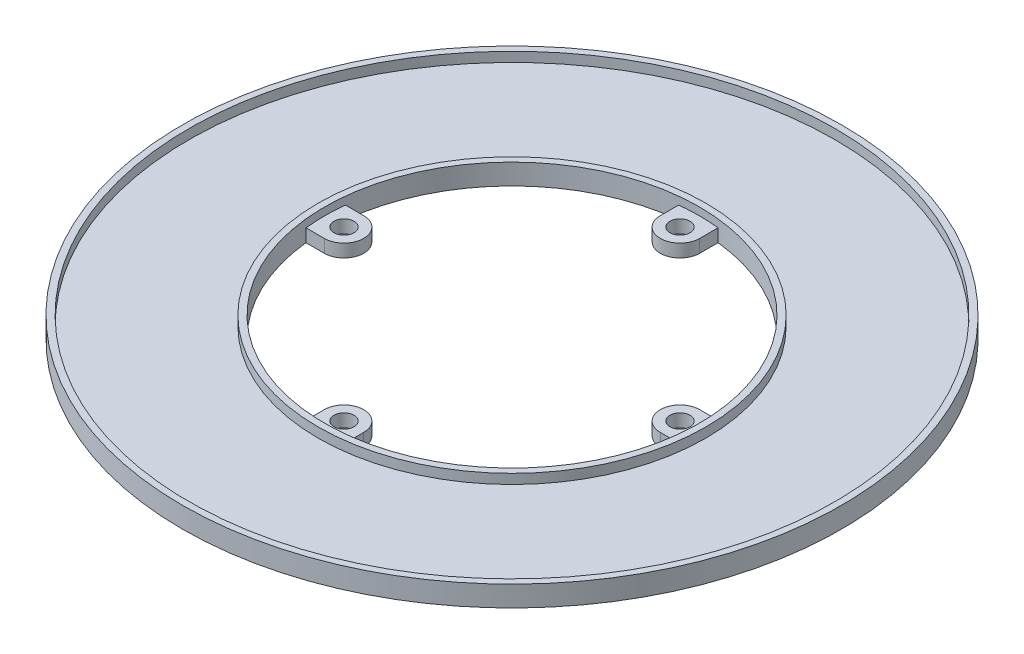
ISO-10303-21;
HEADER;
FILE_DESCRIPTION(('STEP AP214'),'2;1');
FILE_NAME('part.step','',(''),(''),'','','');
FILE_SCHEMA(('AUTOMOTIVE_DESIGN { 1 0 10303 214 1 1 1 1 }'));
ENDSEC;
DATA;
#1=APPLICATION_CONTEXT('core data for automotive mechanical design processes');
#2=APPLICATION_PROTOCOL_DEFINITION('international standard','automotive_design',2000,#1);
#3=PRODUCT_CONTEXT('',#1,'mechanical');
#4=PRODUCT('Part','Part','',(#3));
#5=PRODUCT_RELATED_PRODUCT_CATEGORY('part','',(#4));
#6=PRODUCT_DEFINITION_FORMATION('','',#4);
#7=PRODUCT_DEFINITION_CONTEXT('part definition',#1,'design');
#8=PRODUCT_DEFINITION('design','',#6,#7);
#9=PRODUCT_DEFINITION_SHAPE('','',#8);
#10=(LENGTH_UNIT() NAMED_UNIT(*) SI_UNIT(.MILLI.,.METRE.));
#11=(NAMED_UNIT(*) PLANE_ANGLE_UNIT() SI_UNIT($,.RADIAN.));
#12=(NAMED_UNIT(*) SI_UNIT($,.STERADIAN.) SOLID_ANGLE_UNIT());
#13=UNCERTAINTY_MEASURE_WITH_UNIT(LENGTH_MEASURE(1.E-05),#10,'distance_accuracy_value','');
#14=(GEOMETRIC_REPRESENTATION_CONTEXT(3) GLOBAL_UNCERTAINTY_ASSIGNED_CONTEXT((#13)) GLOBAL_UNIT_ASSIGNED_CONTEXT((#10,
#11,#12)) REPRESENTATION_CONTEXT('',''));
#15=CARTESIAN_POINT('',(0.,0.,0.));
#16=DIRECTION('',(0.,0.,1.));
#17=DIRECTION('',(1.,0.,0.));
#18=AXIS2_PLACEMENT_3D('',#15,#16,#17);
#19=CARTESIAN_POINT('',(0.,0.,0.));
#20=DIRECTION('',(0.,-1.,0.));
#21=DIRECTION('',(0.,0.,-1.));
#22=AXIS2_PLACEMENT_3D('',#19,#20,#21);
#23=CYLINDRICAL_SURFACE('',#22,29.);
#24=CARTESIAN_POINT('',(0.,3.2,0.));
#25=DIRECTION('',(0.,-1.,0.));
#26=DIRECTION('',(0.,0.,-1.));
#27=AXIS2_PLACEMENT_3D('',#24,#25,#26);
#28=CIRCLE('',#27,29.);
#29=CARTESIAN_POINT('',(0.,3.2,-29.));
#30=VERTEX_POINT('',#29);
#31=EDGE_CURVE('E289',#30,#30,#28,.T.);
#32=ORIENTED_EDGE('',*,*,#31,.F.);
#33=EDGE_LOOP('',(#32));
#34=FACE_BOUND('',#33,.T.);
#35=CARTESIAN_POINT('',(0.,2.,0.));
#36=DIRECTION('',(0.,-1.,0.));
#37=DIRECTION('',(0.,0.,-1.));
#38=AXIS2_PLACEMENT_3D('',#35,#36,#37);
#39=CIRCLE('',#38,29.);
#40=CARTESIAN_POINT('',(-28.8391660767089,2.,3.04999999999999));
#41=VERTEX_POINT('',#40);
#42=CARTESIAN_POINT('',(-28.8391660767089,2.,-3.05000000000001));
#43=VERTEX_POINT('',#42);
#44=EDGE_CURVE('E55',#41,#43,#39,.T.);
#45=ORIENTED_EDGE('',*,*,#44,.T.);
#46=DIRECTION('',(0.,-1.,0.));
#47=VECTOR('',#46,1.);
#48=CARTESIAN_POINT('',(-28.8391660767089,2.,-3.04999999999999));
#49=LINE('',#48,#47);
#50=CARTESIAN_POINT('',(-28.8391660767089,0.,-3.04999999999999));
#51=VERTEX_POINT('',#50);
#52=EDGE_CURVE('E295',#43,#51,#49,.T.);
#53=ORIENTED_EDGE('',*,*,#52,.T.);
#54=CARTESIAN_POINT('',(0.,0.,0.));
#55=DIRECTION('',(0.,-1.,0.));
#56=DIRECTION('',(0.,0.,-1.));
#57=AXIS2_PLACEMENT_3D('',#54,#55,#56);
#58=CIRCLE('',#57,29.);
#59=CARTESIAN_POINT('',(-3.05,0.,-28.8391660767089));
#60=VERTEX_POINT('',#59);
#61=EDGE_CURVE('E47',#51,#60,#58,.T.);
#62=ORIENTED_EDGE('',*,*,#61,.T.);
#63=DIRECTION('',(0.,-1.,0.));
#64=VECTOR('',#63,1.);
#65=CARTESIAN_POINT('',(-3.05,2.,-28.8391660767089));
#66=LINE('',#65,#64);
#67=CARTESIAN_POINT('',(-3.05,2.,-28.8391660767089));
#68=VERTEX_POINT('',#67);
#69=EDGE_CURVE('E186',#68,#60,#66,.T.);
#70=ORIENTED_EDGE('',*,*,#69,.F.);
#71=CARTESIAN_POINT('',(0.,2.,0.));
#72=DIRECTION('',(0.,-1.,0.));
#73=DIRECTION('',(0.,0.,-1.));
#74=AXIS2_PLACEMENT_3D('',#71,#72,#73);
#75=CIRCLE('',#74,29.);
#76=CARTESIAN_POINT('',(3.05,2.,-28.8391660767089));
#77=VERTEX_POINT('',#76);
#78=EDGE_CURVE('E209',#68,#77,#75,.T.);
#79=ORIENTED_EDGE('',*,*,#78,.T.);
#80=DIRECTION('',(0.,-1.,0.));
#81=VECTOR('',#80,1.);
#82=CARTESIAN_POINT('',(3.04999999999999,2.,-28.8391660767089));
#83=LINE('',#82,#81);
#84=CARTESIAN_POINT('',(3.04999999999999,0.,-28.8391660767089));
#85=VERTEX_POINT('',#84);
#86=EDGE_CURVE('E169',#77,#85,#83,.T.);
#87=ORIENTED_EDGE('',*,*,#86,.T.);
#88=CARTESIAN_POINT('',(28.8391660767089,0.,-3.05));
#89=VERTEX_POINT('',#88);
#90=EDGE_CURVE('E293',#85,#89,#58,.T.);
#91=ORIENTED_EDGE('',*,*,#90,.T.);
#92=DIRECTION('',(0.,-1.,0.));
#93=VECTOR('',#92,1.);
#94=CARTESIAN_POINT('',(28.8391660767089,2.,-3.05));
#95=LINE('',#94,#93);
#96=CARTESIAN_POINT('',(28.8391660767089,2.,-3.05));
#97=VERTEX_POINT('',#96);
#98=EDGE_CURVE('E215',#97,#89,#95,.T.);
#99=ORIENTED_EDGE('',*,*,#98,.F.);
#100=CARTESIAN_POINT('',(0.,2.,0.));
#101=DIRECTION('',(0.,-1.,0.));
#102=DIRECTION('',(0.,0.,-1.));
#103=AXIS2_PLACEMENT_3D('',#100,#101,#102);
#104=CIRCLE('',#103,29.);
#105=CARTESIAN_POINT('',(28.8391660767089,2.,3.05));
#106=VERTEX_POINT('',#105);
#107=EDGE_CURVE('E239',#97,#106,#104,.T.);
#108=ORIENTED_EDGE('',*,*,#107,.T.);
#109=DIRECTION('',(0.,-1.,0.));
#110=VECTOR('',#109,1.);
#111=CARTESIAN_POINT('',(28.8391660767089,2.,3.05));
#112=LINE('',#111,#110);
#113=CARTESIAN_POINT('',(28.8391660767089,0.,3.05));
#114=VERTEX_POINT('',#113);
#115=EDGE_CURVE('E203',#106,#114,#112,.T.);
#116=ORIENTED_EDGE('',*,*,#115,.T.);
#117=CARTESIAN_POINT('',(3.05,0.,28.8391660767089));
#118=VERTEX_POINT('',#117);
#119=EDGE_CURVE('E48',#114,#118,#58,.T.);
#120=ORIENTED_EDGE('',*,*,#119,.T.);
#121=DIRECTION('',(0.,-1.,0.));
#122=VECTOR('',#121,1.);
#123=CARTESIAN_POINT('',(3.05,2.,28.8391660767089));
#124=LINE('',#123,#122);
#125=CARTESIAN_POINT('',(3.05,2.,28.8391660767089));
#126=VERTEX_POINT('',#125);
#127=EDGE_CURVE('E266',#126,#118,#124,.T.);
#128=ORIENTED_EDGE('',*,*,#127,.F.);
#129=CARTESIAN_POINT('',(0.,2.,0.));
#130=DIRECTION('',(0.,-1.,0.));
#131=DIRECTION('',(0.,0.,-1.));
#132=AXIS2_PLACEMENT_3D('',#129,#130,#131);
#133=CIRCLE('',#132,29.);
#134=CARTESIAN_POINT('',(-3.05,2.,28.8391660767089));
#135=VERTEX_POINT('',#134);
#136=EDGE_CURVE('E246',#126,#135,#133,.T.);
#137=ORIENTED_EDGE('',*,*,#136,.T.);
#138=DIRECTION('',(0.,-1.,0.));
#139=VECTOR('',#138,1.);
#140=CARTESIAN_POINT('',(-3.04999999999999,2.,28.8391660767089));
#141=LINE('',#140,#139);
#142=CARTESIAN_POINT('',(-3.04999999999999,0.,28.8391660767089));
#143=VERTEX_POINT('',#142);
#144=EDGE_CURVE('E269',#135,#143,#141,.T.);
#145=ORIENTED_EDGE('',*,*,#144,.T.);
#146=CARTESIAN_POINT('',(-28.8391660767089,0.,3.04999999999999));
#147=VERTEX_POINT('',#146);
#148=EDGE_CURVE('E11',#143,#147,#58,.T.);
#149=ORIENTED_EDGE('',*,*,#148,.T.);
#150=DIRECTION('',(0.,-1.,0.));
#151=VECTOR('',#150,1.);
#152=CARTESIAN_POINT('',(-28.8391660767089,2.,3.04999999999999));
#153=LINE('',#152,#151);
#154=EDGE_CURVE('E59',#41,#147,#153,.T.);
#155=ORIENTED_EDGE('',*,*,#154,.F.);
#156=EDGE_LOOP('',(#45,#53,#62,#70,#79,#87,#91,#99,#108,#116,#120,#128,#137,#145,#149,#155));
#157=FACE_BOUND('',#156,.T.);
#158=ADVANCED_FACE('F39',(#34,#157),#23,.F.);
#159=CARTESIAN_POINT('',(51.,0.,0.));
#160=DIRECTION('',(0.,-1.,0.));
#161=DIRECTION('',(0.,0.,-1.));
#162=AXIS2_PLACEMENT_3D('',#159,#160,#161);
#163=PLANE('',#162);
#164=CARTESIAN_POINT('',(26.,0.,0.));
#165=DIRECTION('',(0.,-1.,0.));
#166=DIRECTION('',(0.,0.,-1.));
#167=AXIS2_PLACEMENT_3D('',#164,#165,#166);
#168=CIRCLE('',#167,1.55);
#169=CARTESIAN_POINT('',(26.,0.,-1.55000000000009));
#170=VERTEX_POINT('',#169);
#171=EDGE_CURVE('E652',#170,#170,#168,.T.);
#172=ORIENTED_EDGE('',*,*,#171,.F.);
#173=EDGE_LOOP('',(#172));
#174=FACE_BOUND('',#173,.T.);
#175=CARTESIAN_POINT('',(0.,0.,26.));
#176=DIRECTION('',(0.,-1.,0.));
#177=DIRECTION('',(0.,0.,-1.));
#178=AXIS2_PLACEMENT_3D('',#175,#176,#177);
#179=CIRCLE('',#178,1.55);
#180=CARTESIAN_POINT('',(0.,0.,24.45));
#181=VERTEX_POINT('',#180);
#182=EDGE_CURVE('E646',#181,#181,#179,.T.);
#183=ORIENTED_EDGE('',*,*,#182,.F.);
#184=EDGE_LOOP('',(#183));
#185=FACE_BOUND('',#184,.T.);
#186=CARTESIAN_POINT('',(-1.81557029619843E-13,0.,-26.));
#187=DIRECTION('',(0.,-1.,0.));
#188=DIRECTION('',(0.,0.,-1.));
#189=AXIS2_PLACEMENT_3D('',#186,#187,#188);
#190=CIRCLE('',#189,1.55);
#191=CARTESIAN_POINT('',(-1.81557029619843E-13,0.,-27.55));
#192=VERTEX_POINT('',#191);
#193=EDGE_CURVE('E650',#192,#192,#190,.T.);
#194=ORIENTED_EDGE('',*,*,#193,.F.);
#195=EDGE_LOOP('',(#194));
#196=FACE_BOUND('',#195,.T.);
#197=CARTESIAN_POINT('',(-26.,0.,2.72335544429764E-13));
#198=DIRECTION('',(0.,-1.,0.));
#199=DIRECTION('',(0.,0.,-1.));
#200=AXIS2_PLACEMENT_3D('',#197,#198,#199);
#201=CIRCLE('',#200,1.55);
#202=CARTESIAN_POINT('',(-26.,0.,-1.54999999999973));
#203=VERTEX_POINT('',#202);
#204=EDGE_CURVE('E662',#203,#203,#201,.T.);
#205=ORIENTED_EDGE('',*,*,#204,.F.);
#206=EDGE_LOOP('',(#205));
#207=FACE_BOUND('',#206,.T.);
#208=CARTESIAN_POINT('',(0.,0.,0.));
#209=DIRECTION('',(0.,-1.,0.));
#210=DIRECTION('',(0.,0.,-1.));
#211=AXIS2_PLACEMENT_3D('',#208,#209,#210);
#212=CIRCLE('',#211,51.);
#213=CARTESIAN_POINT('',(0.,0.,-51.));
#214=VERTEX_POINT('',#213);
#215=EDGE_CURVE('E272',#214,#214,#212,.T.);
#216=ORIENTED_EDGE('',*,*,#215,.T.);
#217=EDGE_LOOP('',(#216));
#218=FACE_BOUND('',#217,.T.);
#219=ORIENTED_EDGE('',*,*,#148,.F.);
#220=DIRECTION('',(0.,0.,1.));
#221=VECTOR('',#220,1.);
#222=CARTESIAN_POINT('',(-3.05,0.,26.));
#223=LINE('',#222,#221);
#224=CARTESIAN_POINT('',(-3.05,0.,26.));
#225=VERTEX_POINT('',#224);
#226=EDGE_CURVE('E233',#225,#143,#223,.T.);
#227=ORIENTED_EDGE('',*,*,#226,.F.);
#228=CARTESIAN_POINT('',(0.,0.,26.));
#229=DIRECTION('',(0.,-1.,0.));
#230=DIRECTION('',(0.,0.,-1.));
#231=AXIS2_PLACEMENT_3D('',#228,#229,#230);
#232=CIRCLE('',#231,3.05);
#233=CARTESIAN_POINT('',(3.05,0.,26.));
#234=VERTEX_POINT('',#233);
#235=EDGE_CURVE('E247',#225,#234,#232,.T.);
#236=ORIENTED_EDGE('',*,*,#235,.T.);
#237=DIRECTION('',(0.,0.,1.));
#238=VECTOR('',#237,1.);
#239=CARTESIAN_POINT('',(3.05,0.,26.));
#240=LINE('',#239,#238);
#241=EDGE_CURVE('E258',#234,#118,#240,.T.);
#242=ORIENTED_EDGE('',*,*,#241,.T.);
#243=ORIENTED_EDGE('',*,*,#119,.F.);
#244=DIRECTION('',(1.,0.,0.));
#245=VECTOR('',#244,1.);
#246=CARTESIAN_POINT('',(26.,0.,3.05));
#247=LINE('',#246,#245);
#248=CARTESIAN_POINT('',(26.,0.,3.04999999999991));
#249=VERTEX_POINT('',#248);
#250=EDGE_CURVE('E230',#249,#114,#247,.T.);
#251=ORIENTED_EDGE('',*,*,#250,.F.);
#252=CARTESIAN_POINT('',(26.,0.,0.));
#253=DIRECTION('',(0.,-1.,0.));
#254=DIRECTION('',(0.,0.,-1.));
#255=AXIS2_PLACEMENT_3D('',#252,#253,#254);
#256=CIRCLE('',#255,3.05);
#257=CARTESIAN_POINT('',(26.,0.,-3.05000000000009));
#258=VERTEX_POINT('',#257);
#259=EDGE_CURVE('E223',#249,#258,#256,.T.);
#260=ORIENTED_EDGE('',*,*,#259,.T.);
#261=DIRECTION('',(1.,0.,0.));
#262=VECTOR('',#261,1.);
#263=CARTESIAN_POINT('',(26.,0.,-3.05));
#264=LINE('',#263,#262);
#265=EDGE_CURVE('E226',#258,#89,#264,.T.);
#266=ORIENTED_EDGE('',*,*,#265,.T.);
#267=ORIENTED_EDGE('',*,*,#90,.F.);
#268=DIRECTION('',(0.,0.,-1.));
#269=VECTOR('',#268,1.);
#270=CARTESIAN_POINT('',(3.05,0.,-26.));
#271=LINE('',#270,#269);
#272=CARTESIAN_POINT('',(3.04999999999982,0.,-26.));
#273=VERTEX_POINT('',#272);
#274=EDGE_CURVE('E200',#273,#85,#271,.T.);
#275=ORIENTED_EDGE('',*,*,#274,.F.);
#276=CARTESIAN_POINT('',(-1.81557029619843E-13,0.,-26.));
#277=DIRECTION('',(0.,-1.,0.));
#278=DIRECTION('',(0.,0.,-1.));
#279=AXIS2_PLACEMENT_3D('',#276,#277,#278);
#280=CIRCLE('',#279,3.05);
#281=CARTESIAN_POINT('',(-3.05000000000018,0.,-26.));
#282=VERTEX_POINT('',#281);
#283=EDGE_CURVE('E194',#273,#282,#280,.T.);
#284=ORIENTED_EDGE('',*,*,#283,.T.);
#285=DIRECTION('',(0.,0.,-1.));
#286=VECTOR('',#285,1.);
#287=CARTESIAN_POINT('',(-3.05,0.,-26.));
#288=LINE('',#287,#286);
#289=EDGE_CURVE('E197',#282,#60,#288,.T.);
#290=ORIENTED_EDGE('',*,*,#289,.T.);
#291=ORIENTED_EDGE('',*,*,#61,.F.);
#292=DIRECTION('',(-1.,0.,0.));
#293=VECTOR('',#292,1.);
#294=CARTESIAN_POINT('',(-26.,0.,-3.05));
#295=LINE('',#294,#293);
#296=CARTESIAN_POINT('',(-26.,0.,-3.04999999999973));
#297=VERTEX_POINT('',#296);
#298=EDGE_CURVE('E155',#297,#51,#295,.T.);
#299=ORIENTED_EDGE('',*,*,#298,.F.);
#300=CARTESIAN_POINT('',(-26.,0.,2.72335544429764E-13));
#301=DIRECTION('',(0.,-1.,0.));
#302=DIRECTION('',(0.,0.,-1.));
#303=AXIS2_PLACEMENT_3D('',#300,#301,#302);
#304=CIRCLE('',#303,3.05);
#305=CARTESIAN_POINT('',(-26.,0.,3.05000000000027));
#306=VERTEX_POINT('',#305);
#307=EDGE_CURVE('E167',#297,#306,#304,.T.);
#308=ORIENTED_EDGE('',*,*,#307,.T.);
#309=DIRECTION('',(-1.,0.,0.));
#310=VECTOR('',#309,1.);
#311=CARTESIAN_POINT('',(-26.,0.,3.04999999999999));
#312=LINE('',#311,#310);
#313=EDGE_CURVE('E170',#306,#147,#312,.T.);
#314=ORIENTED_EDGE('',*,*,#313,.T.);
#315=EDGE_LOOP('',(#219,#227,#236,#242,#243,#251,#260,#266,#267,#275,#284,#290,#291,#299,#308,#314));
#316=FACE_BOUND('',#315,.T.);
#317=ADVANCED_FACE('F41',(#174,#185,#196,#207,#218,#316),#163,.T.);
#318=CARTESIAN_POINT('',(29.,3.2,0.));
#319=DIRECTION('',(0.,1.,0.));
#320=DIRECTION('',(0.,0.,1.));
#321=AXIS2_PLACEMENT_3D('',#318,#319,#320);
#322=PLANE('',#321);
#323=ORIENTED_EDGE('',*,*,#31,.T.);
#324=EDGE_LOOP('',(#323));
#325=FACE_BOUND('',#324,.T.);
#326=CARTESIAN_POINT('',(0.,3.2,0.));
#327=DIRECTION('',(0.,-1.,0.));
#328=DIRECTION('',(0.,0.,-1.));
#329=AXIS2_PLACEMENT_3D('',#326,#327,#328);
#330=CIRCLE('',#329,30.);
#331=CARTESIAN_POINT('',(0.,3.2,-30.));
#332=VERTEX_POINT('',#331);
#333=EDGE_CURVE('E287',#332,#332,#330,.T.);
#334=ORIENTED_EDGE('',*,*,#333,.F.);
#335=EDGE_LOOP('',(#334));
#336=FACE_BOUND('',#335,.T.);
#337=ADVANCED_FACE('F328',(#325,#336),#322,.T.);
#338=CARTESIAN_POINT('',(0.,0.,0.));
#339=DIRECTION('',(0.,-1.,0.));
#340=DIRECTION('',(0.,0.,-1.));
#341=AXIS2_PLACEMENT_3D('',#338,#339,#340);
#342=CYLINDRICAL_SURFACE('',#341,30.);
#343=ORIENTED_EDGE('',*,*,#333,.T.);
#344=EDGE_LOOP('',(#343));
#345=FACE_BOUND('',#344,.T.);
#346=CARTESIAN_POINT('',(0.,1.7,0.));
#347=DIRECTION('',(0.,-1.,0.));
#348=DIRECTION('',(0.,0.,-1.));
#349=AXIS2_PLACEMENT_3D('',#346,#347,#348);
#350=CIRCLE('',#349,30.);
#351=CARTESIAN_POINT('',(0.,1.7,-30.));
#352=VERTEX_POINT('',#351);
#353=EDGE_CURVE('E284',#352,#352,#350,.T.);
#354=ORIENTED_EDGE('',*,*,#353,.F.);
#355=EDGE_LOOP('',(#354));
#356=FACE_BOUND('',#355,.T.);
#357=ADVANCED_FACE('F333',(#345,#356),#342,.T.);
#358=CARTESIAN_POINT('',(30.,1.7,0.));
#359=DIRECTION('',(0.,1.,0.));
#360=DIRECTION('',(0.,0.,1.));
#361=AXIS2_PLACEMENT_3D('',#358,#359,#360);
#362=PLANE('',#361);
#363=ORIENTED_EDGE('',*,*,#353,.T.);
#364=EDGE_LOOP('',(#363));
#365=FACE_BOUND('',#364,.T.);
#366=CARTESIAN_POINT('',(0.,1.7,0.));
#367=DIRECTION('',(0.,-1.,0.));
#368=DIRECTION('',(0.,0.,-1.));
#369=AXIS2_PLACEMENT_3D('',#366,#367,#368);
#370=CIRCLE('',#369,50.);
#371=CARTESIAN_POINT('',(0.,1.7,-50.));
#372=VERTEX_POINT('',#371);
#373=EDGE_CURVE('E281',#372,#372,#370,.T.);
#374=ORIENTED_EDGE('',*,*,#373,.F.);
#375=EDGE_LOOP('',(#374));
#376=FACE_BOUND('',#375,.T.);
#377=ADVANCED_FACE('F336',(#365,#376),#362,.T.);
#378=CARTESIAN_POINT('',(0.,0.,0.));
#379=DIRECTION('',(0.,-1.,0.));
#380=DIRECTION('',(0.,0.,-1.));
#381=AXIS2_PLACEMENT_3D('',#378,#379,#380);
#382=CYLINDRICAL_SURFACE('',#381,50.);
#383=ORIENTED_EDGE('',*,*,#373,.T.);
#384=EDGE_LOOP('',(#383));
#385=FACE_BOUND('',#384,.T.);
#386=CARTESIAN_POINT('',(0.,3.2,0.));
#387=DIRECTION('',(0.,-1.,0.));
#388=DIRECTION('',(0.,0.,-1.));
#389=AXIS2_PLACEMENT_3D('',#386,#387,#388);
#390=CIRCLE('',#389,50.);
#391=CARTESIAN_POINT('',(0.,3.2,-50.));
#392=VERTEX_POINT('',#391);
#393=EDGE_CURVE('E278',#392,#392,#390,.T.);
#394=ORIENTED_EDGE('',*,*,#393,.F.);
#395=EDGE_LOOP('',(#394));
#396=FACE_BOUND('',#395,.T.);
#397=ADVANCED_FACE('F340',(#385,#396),#382,.F.);
#398=CARTESIAN_POINT('',(50.,3.2,0.));
#399=DIRECTION('',(0.,1.,0.));
#400=DIRECTION('',(0.,0.,1.));
#401=AXIS2_PLACEMENT_3D('',#398,#399,#400);
#402=PLANE('',#401);
#403=ORIENTED_EDGE('',*,*,#393,.T.);
#404=EDGE_LOOP('',(#403));
#405=FACE_BOUND('',#404,.T.);
#406=CARTESIAN_POINT('',(0.,3.2,0.));
#407=DIRECTION('',(0.,-1.,0.));
#408=DIRECTION('',(0.,0.,-1.));
#409=AXIS2_PLACEMENT_3D('',#406,#407,#408);
#410=CIRCLE('',#409,51.);
#411=CARTESIAN_POINT('',(0.,3.2,-51.));
#412=VERTEX_POINT('',#411);
#413=EDGE_CURVE('E275',#412,#412,#410,.T.);
#414=ORIENTED_EDGE('',*,*,#413,.F.);
#415=EDGE_LOOP('',(#414));
#416=FACE_BOUND('',#415,.T.);
#417=ADVANCED_FACE('F344',(#405,#416),#402,.T.);
#418=CARTESIAN_POINT('',(0.,0.,0.));
#419=DIRECTION('',(0.,-1.,0.));
#420=DIRECTION('',(0.,0.,-1.));
#421=AXIS2_PLACEMENT_3D('',#418,#419,#420);
#422=CYLINDRICAL_SURFACE('',#421,51.);
#423=ORIENTED_EDGE('',*,*,#413,.T.);
#424=EDGE_LOOP('',(#423));
#425=FACE_BOUND('',#424,.T.);
#426=ORIENTED_EDGE('',*,*,#215,.F.);
#427=EDGE_LOOP('',(#426));
#428=FACE_BOUND('',#427,.T.);
#429=ADVANCED_FACE('F348',(#425,#428),#422,.T.);
#430=CARTESIAN_POINT('',(-3.05,2.,26.));
#431=DIRECTION('',(1.,0.,0.));
#432=DIRECTION('',(0.,0.,-1.));
#433=AXIS2_PLACEMENT_3D('',#430,#431,#432);
#434=PLANE('',#433);
#435=ORIENTED_EDGE('',*,*,#226,.T.);
#436=ORIENTED_EDGE('',*,*,#144,.F.);
#437=DIRECTION('',(0.,0.,1.));
#438=VECTOR('',#437,1.);
#439=CARTESIAN_POINT('',(-3.05,2.,26.));
#440=LINE('',#439,#438);
#441=CARTESIAN_POINT('',(-3.05,2.,26.));
#442=VERTEX_POINT('',#441);
#443=EDGE_CURVE('E243',#442,#135,#440,.T.);
#444=ORIENTED_EDGE('',*,*,#443,.F.);
#445=DIRECTION('',(0.,-1.,0.));
#446=VECTOR('',#445,1.);
#447=CARTESIAN_POINT('',(-3.05,2.,26.));
#448=LINE('',#447,#446);
#449=EDGE_CURVE('E255',#442,#225,#448,.T.);
#450=ORIENTED_EDGE('',*,*,#449,.T.);
#451=EDGE_LOOP('',(#435,#436,#444,#450));
#452=FACE_BOUND('',#451,.T.);
#453=ADVANCED_FACE('F352',(#452),#434,.F.);
#454=CARTESIAN_POINT('',(3.05,2.,26.));
#455=DIRECTION('',(1.,0.,0.));
#456=DIRECTION('',(0.,0.,-1.));
#457=AXIS2_PLACEMENT_3D('',#454,#455,#456);
#458=PLANE('',#457);
#459=ORIENTED_EDGE('',*,*,#241,.F.);
#460=DIRECTION('',(0.,-1.,0.));
#461=VECTOR('',#460,1.);
#462=CARTESIAN_POINT('',(3.05,2.,26.));
#463=LINE('',#462,#461);
#464=CARTESIAN_POINT('',(3.05,2.,26.));
#465=VERTEX_POINT('',#464);
#466=EDGE_CURVE('E264',#465,#234,#463,.T.);
#467=ORIENTED_EDGE('',*,*,#466,.F.);
#468=DIRECTION('',(0.,0.,1.));
#469=VECTOR('',#468,1.);
#470=CARTESIAN_POINT('',(3.05,2.,26.));
#471=LINE('',#470,#469);
#472=EDGE_CURVE('E249',#465,#126,#471,.T.);
#473=ORIENTED_EDGE('',*,*,#472,.T.);
#474=ORIENTED_EDGE('',*,*,#127,.T.);
#475=EDGE_LOOP('',(#459,#467,#473,#474));
#476=FACE_BOUND('',#475,.T.);
#477=ADVANCED_FACE('F356',(#476),#458,.T.);
#478=CARTESIAN_POINT('',(0.,2.,26.));
#479=DIRECTION('',(0.,-1.,0.));
#480=DIRECTION('',(0.,0.,-1.));
#481=AXIS2_PLACEMENT_3D('',#478,#479,#480);
#482=CYLINDRICAL_SURFACE('',#481,3.05);
#483=ORIENTED_EDGE('',*,*,#235,.F.);
#484=ORIENTED_EDGE('',*,*,#449,.F.);
#485=CARTESIAN_POINT('',(0.,2.,26.));
#486=DIRECTION('',(0.,-1.,0.));
#487=DIRECTION('',(0.,0.,-1.));
#488=AXIS2_PLACEMENT_3D('',#485,#486,#487);
#489=CIRCLE('',#488,3.05);
#490=EDGE_CURVE('E252',#442,#465,#489,.T.);
#491=ORIENTED_EDGE('',*,*,#490,.T.);
#492=ORIENTED_EDGE('',*,*,#466,.T.);
#493=EDGE_LOOP('',(#483,#484,#491,#492));
#494=FACE_BOUND('',#493,.T.);
#495=ADVANCED_FACE('F360',(#494),#482,.T.);
#496=CARTESIAN_POINT('',(0.,2.,0.));
#497=DIRECTION('',(0.,-1.,0.));
#498=DIRECTION('',(0.,0.,-1.));
#499=AXIS2_PLACEMENT_3D('',#496,#497,#498);
#500=PLANE('',#499);
#501=CARTESIAN_POINT('',(0.,2.,26.));
#502=DIRECTION('',(0.,-1.,0.));
#503=DIRECTION('',(0.,0.,-1.));
#504=AXIS2_PLACEMENT_3D('',#501,#502,#503);
#505=CIRCLE('',#504,1.55);
#506=CARTESIAN_POINT('',(0.,2.,24.45));
#507=VERTEX_POINT('',#506);
#508=EDGE_CURVE('E649',#507,#507,#505,.F.);
#509=ORIENTED_EDGE('',*,*,#508,.F.);
#510=EDGE_LOOP('',(#509));
#511=FACE_BOUND('',#510,.T.);
#512=ORIENTED_EDGE('',*,*,#443,.T.);
#513=ORIENTED_EDGE('',*,*,#136,.F.);
#514=ORIENTED_EDGE('',*,*,#472,.F.);
#515=ORIENTED_EDGE('',*,*,#490,.F.);
#516=EDGE_LOOP('',(#512,#513,#514,#515));
#517=FACE_BOUND('',#516,.T.);
#518=ADVANCED_FACE('F364',(#511,#517),#500,.F.);
#519=CARTESIAN_POINT('',(26.,2.,3.05));
#520=DIRECTION('',(0.,0.,-1.));
#521=DIRECTION('',(-1.,0.,0.));
#522=AXIS2_PLACEMENT_3D('',#519,#520,#521);
#523=PLANE('',#522);
#524=ORIENTED_EDGE('',*,*,#250,.T.);
#525=ORIENTED_EDGE('',*,*,#115,.F.);
#526=DIRECTION('',(1.,0.,0.));
#527=VECTOR('',#526,1.);
#528=CARTESIAN_POINT('',(26.,2.,3.05));
#529=LINE('',#528,#527);
#530=CARTESIAN_POINT('',(26.,2.,3.04999999999991));
#531=VERTEX_POINT('',#530);
#532=EDGE_CURVE('E227',#531,#106,#529,.T.);
#533=ORIENTED_EDGE('',*,*,#532,.F.);
#534=DIRECTION('',(0.,-1.,0.));
#535=VECTOR('',#534,1.);
#536=CARTESIAN_POINT('',(26.,2.,3.04999999999991));
#537=LINE('',#536,#535);
#538=EDGE_CURVE('E220',#531,#249,#537,.T.);
#539=ORIENTED_EDGE('',*,*,#538,.T.);
#540=EDGE_LOOP('',(#524,#525,#533,#539));
#541=FACE_BOUND('',#540,.T.);
#542=ADVANCED_FACE('F367',(#541),#523,.F.);
#543=CARTESIAN_POINT('',(26.,2.,-3.05));
#544=DIRECTION('',(0.,0.,-1.));
#545=DIRECTION('',(-1.,0.,0.));
#546=AXIS2_PLACEMENT_3D('',#543,#544,#545);
#547=PLANE('',#546);
#548=ORIENTED_EDGE('',*,*,#265,.F.);
#549=DIRECTION('',(0.,-1.,0.));
#550=VECTOR('',#549,1.);
#551=CARTESIAN_POINT('',(26.,2.,-3.05000000000009));
#552=LINE('',#551,#550);
#553=CARTESIAN_POINT('',(26.,2.,-3.05000000000009));
#554=VERTEX_POINT('',#553);
#555=EDGE_CURVE('E218',#554,#258,#552,.T.);
#556=ORIENTED_EDGE('',*,*,#555,.F.);
#557=DIRECTION('',(1.,0.,0.));
#558=VECTOR('',#557,1.);
#559=CARTESIAN_POINT('',(26.,2.,-3.05));
#560=LINE('',#559,#558);
#561=EDGE_CURVE('E236',#554,#97,#560,.T.);
#562=ORIENTED_EDGE('',*,*,#561,.T.);
#563=ORIENTED_EDGE('',*,*,#98,.T.);
#564=EDGE_LOOP('',(#548,#556,#562,#563));
#565=FACE_BOUND('',#564,.T.);
#566=ADVANCED_FACE('F372',(#565),#547,.T.);
#567=CARTESIAN_POINT('',(26.,2.,0.));
#568=DIRECTION('',(0.,-1.,0.));
#569=DIRECTION('',(0.,0.,-1.));
#570=AXIS2_PLACEMENT_3D('',#567,#568,#569);
#571=CYLINDRICAL_SURFACE('',#570,3.05);
#572=ORIENTED_EDGE('',*,*,#259,.F.);
#573=ORIENTED_EDGE('',*,*,#538,.F.);
#574=CARTESIAN_POINT('',(26.,2.,0.));
#575=DIRECTION('',(0.,-1.,0.));
#576=DIRECTION('',(0.,0.,-1.));
#577=AXIS2_PLACEMENT_3D('',#574,#575,#576);
#578=CIRCLE('',#577,3.05);
#579=EDGE_CURVE('E222',#531,#554,#578,.T.);
#580=ORIENTED_EDGE('',*,*,#579,.T.);
#581=ORIENTED_EDGE('',*,*,#555,.T.);
#582=EDGE_LOOP('',(#572,#573,#580,#581));
#583=FACE_BOUND('',#582,.T.);
#584=ADVANCED_FACE('F319',(#583),#571,.T.);
#585=CARTESIAN_POINT('',(0.,2.,0.));
#586=DIRECTION('',(0.,-1.,0.));
#587=DIRECTION('',(0.,0.,-1.));
#588=AXIS2_PLACEMENT_3D('',#585,#586,#587);
#589=PLANE('',#588);
#590=CARTESIAN_POINT('',(26.,2.,0.));
#591=DIRECTION('',(0.,-1.,0.));
#592=DIRECTION('',(0.,0.,-1.));
#593=AXIS2_PLACEMENT_3D('',#590,#591,#592);
#594=CIRCLE('',#593,1.55);
#595=CARTESIAN_POINT('',(26.,2.,-1.55000000000009));
#596=VERTEX_POINT('',#595);
#597=EDGE_CURVE('E658',#596,#596,#594,.F.);
#598=ORIENTED_EDGE('',*,*,#597,.F.);
#599=EDGE_LOOP('',(#598));
#600=FACE_BOUND('',#599,.T.);
#601=ORIENTED_EDGE('',*,*,#532,.T.);
#602=ORIENTED_EDGE('',*,*,#107,.F.);
#603=ORIENTED_EDGE('',*,*,#561,.F.);
#604=ORIENTED_EDGE('',*,*,#579,.F.);
#605=EDGE_LOOP('',(#601,#602,#603,#604));
#606=FACE_BOUND('',#605,.T.);
#607=ADVANCED_FACE('F312',(#600,#606),#589,.F.);
#608=CARTESIAN_POINT('',(3.05,2.,-26.));
#609=DIRECTION('',(-1.,0.,0.));
#610=DIRECTION('',(0.,0.,1.));
#611=AXIS2_PLACEMENT_3D('',#608,#609,#610);
#612=PLANE('',#611);
#613=ORIENTED_EDGE('',*,*,#274,.T.);
#614=ORIENTED_EDGE('',*,*,#86,.F.);
#615=DIRECTION('',(0.,0.,-1.));
#616=VECTOR('',#615,1.);
#617=CARTESIAN_POINT('',(3.05,2.,-26.));
#618=LINE('',#617,#616);
#619=CARTESIAN_POINT('',(3.04999999999982,2.,-26.));
#620=VERTEX_POINT('',#619);
#621=EDGE_CURVE('E198',#620,#77,#618,.T.);
#622=ORIENTED_EDGE('',*,*,#621,.F.);
#623=DIRECTION('',(0.,-1.,0.));
#624=VECTOR('',#623,1.);
#625=CARTESIAN_POINT('',(3.04999999999982,2.,-26.));
#626=LINE('',#625,#624);
#627=EDGE_CURVE('E191',#620,#273,#626,.T.);
#628=ORIENTED_EDGE('',*,*,#627,.T.);
#629=EDGE_LOOP('',(#613,#614,#622,#628));
#630=FACE_BOUND('',#629,.T.);
#631=ADVANCED_FACE('F310',(#630),#612,.F.);
#632=CARTESIAN_POINT('',(-3.05,2.,-26.));
#633=DIRECTION('',(-1.,0.,0.));
#634=DIRECTION('',(0.,0.,1.));
#635=AXIS2_PLACEMENT_3D('',#632,#633,#634);
#636=PLANE('',#635);
#637=ORIENTED_EDGE('',*,*,#289,.F.);
#638=DIRECTION('',(0.,-1.,0.));
#639=VECTOR('',#638,1.);
#640=CARTESIAN_POINT('',(-3.05000000000018,2.,-26.));
#641=LINE('',#640,#639);
#642=CARTESIAN_POINT('',(-3.05000000000018,2.,-26.));
#643=VERTEX_POINT('',#642);
#644=EDGE_CURVE('E189',#643,#282,#641,.T.);
#645=ORIENTED_EDGE('',*,*,#644,.F.);
#646=DIRECTION('',(0.,0.,-1.));
#647=VECTOR('',#646,1.);
#648=CARTESIAN_POINT('',(-3.05,2.,-26.));
#649=LINE('',#648,#647);
#650=EDGE_CURVE('E206',#643,#68,#649,.T.);
#651=ORIENTED_EDGE('',*,*,#650,.T.);
#652=ORIENTED_EDGE('',*,*,#69,.T.);
#653=EDGE_LOOP('',(#637,#645,#651,#652));
#654=FACE_BOUND('',#653,.T.);
#655=ADVANCED_FACE('F298',(#654),#636,.T.);
#656=CARTESIAN_POINT('',(-1.81557029619843E-13,2.,-26.));
#657=DIRECTION('',(0.,-1.,0.));
#658=DIRECTION('',(0.,0.,-1.));
#659=AXIS2_PLACEMENT_3D('',#656,#657,#658);
#660=CYLINDRICAL_SURFACE('',#659,3.05);
#661=ORIENTED_EDGE('',*,*,#283,.F.);
#662=ORIENTED_EDGE('',*,*,#627,.F.);
#663=CARTESIAN_POINT('',(-1.81557029619843E-13,2.,-26.));
#664=DIRECTION('',(0.,-1.,0.));
#665=DIRECTION('',(0.,0.,-1.));
#666=AXIS2_PLACEMENT_3D('',#663,#664,#665);
#667=CIRCLE('',#666,3.05);
#668=EDGE_CURVE('E193',#620,#643,#667,.T.);
#669=ORIENTED_EDGE('',*,*,#668,.T.);
#670=ORIENTED_EDGE('',*,*,#644,.T.);
#671=EDGE_LOOP('',(#661,#662,#669,#670));
#672=FACE_BOUND('',#671,.T.);
#673=ADVANCED_FACE('F303',(#672),#660,.T.);
#674=CARTESIAN_POINT('',(0.,2.,0.));
#675=DIRECTION('',(0.,-1.,0.));
#676=DIRECTION('',(0.,0.,-1.));
#677=AXIS2_PLACEMENT_3D('',#674,#675,#676);
#678=PLANE('',#677);
#679=CARTESIAN_POINT('',(-1.81557029619843E-13,2.,-26.));
#680=DIRECTION('',(0.,-1.,0.));
#681=DIRECTION('',(0.,0.,-1.));
#682=AXIS2_PLACEMENT_3D('',#679,#680,#681);
#683=CIRCLE('',#682,1.55);
#684=CARTESIAN_POINT('',(-1.81557029619843E-13,2.,-27.55));
#685=VERTEX_POINT('',#684);
#686=EDGE_CURVE('E655',#685,#685,#683,.F.);
#687=ORIENTED_EDGE('',*,*,#686,.F.);
#688=EDGE_LOOP('',(#687));
#689=FACE_BOUND('',#688,.T.);
#690=ORIENTED_EDGE('',*,*,#621,.T.);
#691=ORIENTED_EDGE('',*,*,#78,.F.);
#692=ORIENTED_EDGE('',*,*,#650,.F.);
#693=ORIENTED_EDGE('',*,*,#668,.F.);
#694=EDGE_LOOP('',(#690,#691,#692,#693));
#695=FACE_BOUND('',#694,.T.);
#696=ADVANCED_FACE('F307',(#689,#695),#678,.F.);
#697=CARTESIAN_POINT('',(-26.,2.,-3.05));
#698=DIRECTION('',(0.,0.,1.));
#699=DIRECTION('',(1.,0.,0.));
#700=AXIS2_PLACEMENT_3D('',#697,#698,#699);
#701=PLANE('',#700);
#702=ORIENTED_EDGE('',*,*,#298,.T.);
#703=ORIENTED_EDGE('',*,*,#52,.F.);
#704=DIRECTION('',(-1.,0.,0.));
#705=VECTOR('',#704,1.);
#706=CARTESIAN_POINT('',(-26.,2.,-3.05));
#707=LINE('',#706,#705);
#708=CARTESIAN_POINT('',(-26.,2.,-3.04999999999973));
#709=VERTEX_POINT('',#708);
#710=EDGE_CURVE('E156',#709,#43,#707,.T.);
#711=ORIENTED_EDGE('',*,*,#710,.F.);
#712=DIRECTION('',(0.,-1.,0.));
#713=VECTOR('',#712,1.);
#714=CARTESIAN_POINT('',(-26.,2.,-3.04999999999973));
#715=LINE('',#714,#713);
#716=EDGE_CURVE('E151',#709,#297,#715,.T.);
#717=ORIENTED_EDGE('',*,*,#716,.T.);
#718=EDGE_LOOP('',(#702,#703,#711,#717));
#719=FACE_BOUND('',#718,.T.);
#720=ADVANCED_FACE('F153',(#719),#701,.F.);
#721=CARTESIAN_POINT('',(-26.,2.,3.04999999999999));
#722=DIRECTION('',(0.,0.,1.));
#723=DIRECTION('',(1.,0.,0.));
#724=AXIS2_PLACEMENT_3D('',#721,#722,#723);
#725=PLANE('',#724);
#726=ORIENTED_EDGE('',*,*,#313,.F.);
#727=DIRECTION('',(0.,-1.,0.));
#728=VECTOR('',#727,1.);
#729=CARTESIAN_POINT('',(-26.,2.,3.05000000000027));
#730=LINE('',#729,#728);
#731=CARTESIAN_POINT('',(-26.,2.,3.05000000000027));
#732=VERTEX_POINT('',#731);
#733=EDGE_CURVE('E162',#732,#306,#730,.T.);
#734=ORIENTED_EDGE('',*,*,#733,.F.);
#735=DIRECTION('',(-1.,0.,0.));
#736=VECTOR('',#735,1.);
#737=CARTESIAN_POINT('',(-26.,2.,3.04999999999999));
#738=LINE('',#737,#736);
#739=EDGE_CURVE('E180',#732,#41,#738,.T.);
#740=ORIENTED_EDGE('',*,*,#739,.T.);
#741=ORIENTED_EDGE('',*,*,#154,.T.);
#742=EDGE_LOOP('',(#726,#734,#740,#741));
#743=FACE_BOUND('',#742,.T.);
#744=ADVANCED_FACE('F400',(#743),#725,.T.);
#745=CARTESIAN_POINT('',(-26.,2.,2.72335544429764E-13));
#746=DIRECTION('',(0.,-1.,0.));
#747=DIRECTION('',(0.,0.,-1.));
#748=AXIS2_PLACEMENT_3D('',#745,#746,#747);
#749=CYLINDRICAL_SURFACE('',#748,3.05);
#750=ORIENTED_EDGE('',*,*,#307,.F.);
#751=ORIENTED_EDGE('',*,*,#716,.F.);
#752=CARTESIAN_POINT('',(-26.,2.,2.72335544429764E-13));
#753=DIRECTION('',(0.,-1.,0.));
#754=DIRECTION('',(0.,0.,-1.));
#755=AXIS2_PLACEMENT_3D('',#752,#753,#754);
#756=CIRCLE('',#755,3.05);
#757=EDGE_CURVE('E161',#709,#732,#756,.T.);
#758=ORIENTED_EDGE('',*,*,#757,.T.);
#759=ORIENTED_EDGE('',*,*,#733,.T.);
#760=EDGE_LOOP('',(#750,#751,#758,#759));
#761=FACE_BOUND('',#760,.T.);
#762=ADVANCED_FACE('F172',(#761),#749,.T.);
#763=CARTESIAN_POINT('',(0.,2.,0.));
#764=DIRECTION('',(0.,-1.,0.));
#765=DIRECTION('',(0.,0.,-1.));
#766=AXIS2_PLACEMENT_3D('',#763,#764,#765);
#767=PLANE('',#766);
#768=CARTESIAN_POINT('',(-26.,2.,2.72335544429764E-13));
#769=DIRECTION('',(0.,-1.,0.));
#770=DIRECTION('',(0.,0.,-1.));
#771=AXIS2_PLACEMENT_3D('',#768,#769,#770);
#772=CIRCLE('',#771,1.55);
#773=CARTESIAN_POINT('',(-26.,2.,-1.54999999999973));
#774=VERTEX_POINT('',#773);
#775=EDGE_CURVE('E664',#774,#774,#772,.F.);
#776=ORIENTED_EDGE('',*,*,#775,.F.);
#777=EDGE_LOOP('',(#776));
#778=FACE_BOUND('',#777,.T.);
#779=ORIENTED_EDGE('',*,*,#710,.T.);
#780=ORIENTED_EDGE('',*,*,#44,.F.);
#781=ORIENTED_EDGE('',*,*,#739,.F.);
#782=ORIENTED_EDGE('',*,*,#757,.F.);
#783=EDGE_LOOP('',(#779,#780,#781,#782));
#784=FACE_BOUND('',#783,.T.);
#785=ADVANCED_FACE('F414',(#778,#784),#767,.F.);
#786=CARTESIAN_POINT('',(-26.,3.201,2.72335544429764E-13));
#787=DIRECTION('',(0.,-1.,0.));
#788=DIRECTION('',(0.,0.,-1.));
#789=AXIS2_PLACEMENT_3D('',#786,#787,#788);
#790=CYLINDRICAL_SURFACE('',#789,1.55);
#791=ORIENTED_EDGE('',*,*,#204,.T.);
#792=EDGE_LOOP('',(#791));
#793=FACE_BOUND('',#792,.T.);
#794=ORIENTED_EDGE('',*,*,#775,.T.);
#795=EDGE_LOOP('',(#794));
#796=FACE_BOUND('',#795,.T.);
#797=ADVANCED_FACE('F421',(#793,#796),#790,.F.);
#798=CARTESIAN_POINT('',(-1.81557029619843E-13,3.201,-26.));
#799=DIRECTION('',(0.,-1.,0.));
#800=DIRECTION('',(0.,0.,-1.));
#801=AXIS2_PLACEMENT_3D('',#798,#799,#800);
#802=CYLINDRICAL_SURFACE('',#801,1.55);
#803=ORIENTED_EDGE('',*,*,#193,.T.);
#804=EDGE_LOOP('',(#803));
#805=FACE_BOUND('',#804,.T.);
#806=ORIENTED_EDGE('',*,*,#686,.T.);
#807=EDGE_LOOP('',(#806));
#808=FACE_BOUND('',#807,.T.);
#809=ADVANCED_FACE('F428',(#805,#808),#802,.F.);
#810=CARTESIAN_POINT('',(26.,3.201,0.));
#811=DIRECTION('',(0.,-1.,0.));
#812=DIRECTION('',(0.,0.,-1.));
#813=AXIS2_PLACEMENT_3D('',#810,#811,#812);
#814=CYLINDRICAL_SURFACE('',#813,1.55);
#815=ORIENTED_EDGE('',*,*,#171,.T.);
#816=EDGE_LOOP('',(#815));
#817=FACE_BOUND('',#816,.T.);
#818=ORIENTED_EDGE('',*,*,#597,.T.);
#819=EDGE_LOOP('',(#818));
#820=FACE_BOUND('',#819,.T.);
#821=ADVANCED_FACE('F436',(#817,#820),#814,.F.);
#822=CARTESIAN_POINT('',(0.,3.201,26.));
#823=DIRECTION('',(0.,-1.,0.));
#824=DIRECTION('',(0.,0.,-1.));
#825=AXIS2_PLACEMENT_3D('',#822,#823,#824);
#826=CYLINDRICAL_SURFACE('',#825,1.55);
#827=ORIENTED_EDGE('',*,*,#182,.T.);
#828=EDGE_LOOP('',(#827));
#829=FACE_BOUND('',#828,.T.);
#830=ORIENTED_EDGE('',*,*,#508,.T.);
#831=EDGE_LOOP('',(#830));
#832=FACE_BOUND('',#831,.T.);
#833=ADVANCED_FACE('F444',(#829,#832),#826,.F.);
#834=CLOSED_SHELL('',(#158,#317,#337,#357,#377,#397,#417,#429,#453,#477,#495,#518,#542,#566,
#584,#607,#631,#655,#673,#696,#720,#744,#762,#785,#797,#809,#821,#833));
#835=MANIFOLD_SOLID_BREP('B2',#834);
#836=ADVANCED_BREP_SHAPE_REPRESENTATION('',(#18,#835),#14);
#837=SHAPE_DEFINITION_REPRESENTATION(#9,#836);
ENDSEC;
END-ISO-10303-21;
